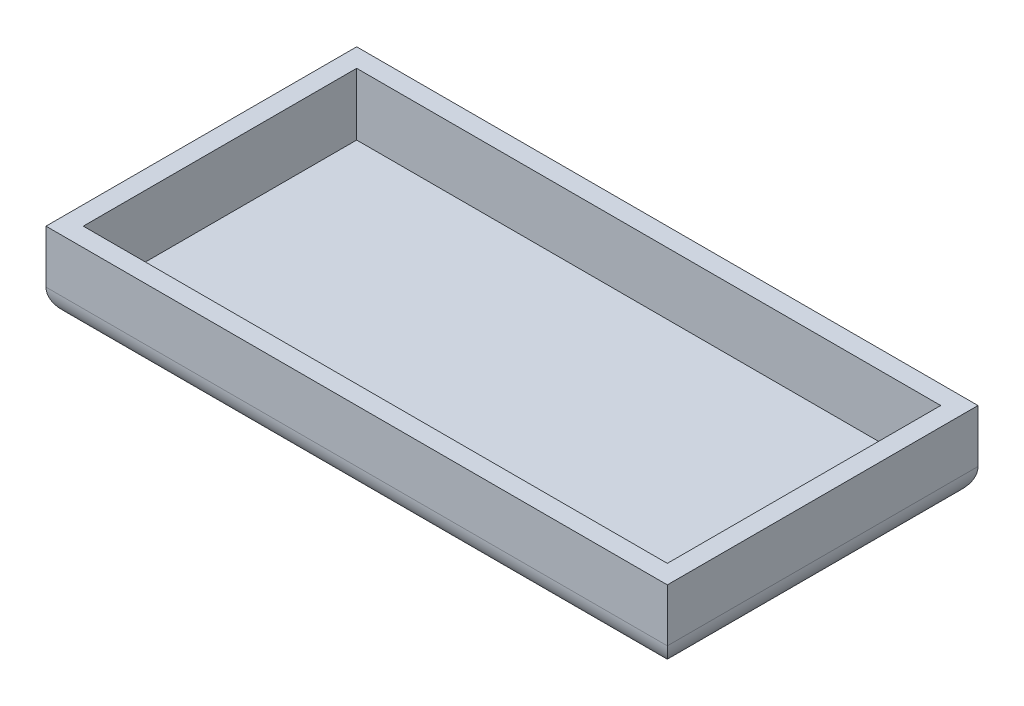
ISO-10303-21;
HEADER;
FILE_DESCRIPTION(('STEP AP214'),'2;1');
FILE_NAME('part.step','',(''),(''),'','','');
FILE_SCHEMA(('AUTOMOTIVE_DESIGN { 1 0 10303 214 1 1 1 1 }'));
ENDSEC;
DATA;
#1=APPLICATION_CONTEXT('core data for automotive mechanical design processes');
#2=APPLICATION_PROTOCOL_DEFINITION('international standard','automotive_design',2000,#1);
#3=PRODUCT_CONTEXT('',#1,'mechanical');
#4=PRODUCT('Part','Part','',(#3));
#5=PRODUCT_RELATED_PRODUCT_CATEGORY('part','',(#4));
#6=PRODUCT_DEFINITION_FORMATION('','',#4);
#7=PRODUCT_DEFINITION_CONTEXT('part definition',#1,'design');
#8=PRODUCT_DEFINITION('design','',#6,#7);
#9=PRODUCT_DEFINITION_SHAPE('','',#8);
#10=(LENGTH_UNIT() NAMED_UNIT(*) SI_UNIT(.MILLI.,.METRE.));
#11=(NAMED_UNIT(*) PLANE_ANGLE_UNIT() SI_UNIT($,.RADIAN.));
#12=(NAMED_UNIT(*) SI_UNIT($,.STERADIAN.) SOLID_ANGLE_UNIT());
#13=UNCERTAINTY_MEASURE_WITH_UNIT(LENGTH_MEASURE(1.E-05),#10,'distance_accuracy_value','');
#14=(GEOMETRIC_REPRESENTATION_CONTEXT(3) GLOBAL_UNCERTAINTY_ASSIGNED_CONTEXT((#13)) GLOBAL_UNIT_ASSIGNED_CONTEXT((#10,
#11,#12)) REPRESENTATION_CONTEXT('',''));
#15=CARTESIAN_POINT('',(0.,0.,0.));
#16=DIRECTION('',(0.,0.,1.));
#17=DIRECTION('',(1.,0.,0.));
#18=AXIS2_PLACEMENT_3D('',#15,#16,#17);
#19=CARTESIAN_POINT('',(2000.,120.,1000.));
#20=DIRECTION('',(-1.,0.,0.));
#21=DIRECTION('',(0.,0.,1.));
#22=AXIS2_PLACEMENT_3D('',#19,#20,#21);
#23=PLANE('',#22);
#24=DIRECTION('',(0.,-1.,0.));
#25=VECTOR('',#24,1.);
#26=CARTESIAN_POINT('',(2000.,120.,1000.));
#27=LINE('',#26,#25);
#28=CARTESIAN_POINT('',(2000.,520.,1000.));
#29=VERTEX_POINT('',#28);
#30=CARTESIAN_POINT('',(2000.,180.,1000.));
#31=VERTEX_POINT('',#30);
#32=EDGE_CURVE('E168',#29,#31,#27,.T.);
#33=ORIENTED_EDGE('',*,*,#32,.T.);
#34=DIRECTION('',(0.,0.,-1.));
#35=VECTOR('',#34,1.);
#36=CARTESIAN_POINT('',(2000.,180.,-1000.));
#37=LINE('',#36,#35);
#38=CARTESIAN_POINT('',(2000.,180.,-1000.));
#39=VERTEX_POINT('',#38);
#40=EDGE_CURVE('E45',#31,#39,#37,.T.);
#41=ORIENTED_EDGE('',*,*,#40,.T.);
#42=DIRECTION('',(0.,-1.,0.));
#43=VECTOR('',#42,1.);
#44=CARTESIAN_POINT('',(2000.,120.,-1000.));
#45=LINE('',#44,#43);
#46=CARTESIAN_POINT('',(2000.,520.,-1000.));
#47=VERTEX_POINT('',#46);
#48=EDGE_CURVE('E175',#47,#39,#45,.T.);
#49=ORIENTED_EDGE('',*,*,#48,.F.);
#50=DIRECTION('',(0.,0.,-1.));
#51=VECTOR('',#50,1.);
#52=CARTESIAN_POINT('',(2000.,520.,1000.));
#53=LINE('',#52,#51);
#54=EDGE_CURVE('E133',#29,#47,#53,.T.);
#55=ORIENTED_EDGE('',*,*,#54,.F.);
#56=EDGE_LOOP('',(#33,#41,#49,#55));
#57=FACE_BOUND('',#56,.T.);
#58=ADVANCED_FACE('F36',(#57),#23,.F.);
#59=CARTESIAN_POINT('',(-2000.,120.,-1000.));
#60=DIRECTION('',(0.,0.,1.));
#61=DIRECTION('',(1.,0.,0.));
#62=AXIS2_PLACEMENT_3D('',#59,#60,#61);
#63=PLANE('',#62);
#64=ORIENTED_EDGE('',*,*,#48,.T.);
#65=DIRECTION('',(-1.,0.,0.));
#66=VECTOR('',#65,1.);
#67=CARTESIAN_POINT('',(-2000.,180.,-1000.));
#68=LINE('',#67,#66);
#69=CARTESIAN_POINT('',(-2000.,180.,-1000.));
#70=VERTEX_POINT('',#69);
#71=EDGE_CURVE('E11',#39,#70,#68,.T.);
#72=ORIENTED_EDGE('',*,*,#71,.T.);
#73=DIRECTION('',(0.,-1.,0.));
#74=VECTOR('',#73,1.);
#75=CARTESIAN_POINT('',(-2000.,120.,-1000.));
#76=LINE('',#75,#74);
#77=CARTESIAN_POINT('',(-2000.,520.,-1000.));
#78=VERTEX_POINT('',#77);
#79=EDGE_CURVE('E172',#78,#70,#76,.T.);
#80=ORIENTED_EDGE('',*,*,#79,.F.);
#81=DIRECTION('',(-1.,0.,0.));
#82=VECTOR('',#81,1.);
#83=CARTESIAN_POINT('',(2000.,520.,-1000.));
#84=LINE('',#83,#82);
#85=EDGE_CURVE('E159',#47,#78,#84,.T.);
#86=ORIENTED_EDGE('',*,*,#85,.F.);
#87=EDGE_LOOP('',(#64,#72,#80,#86));
#88=FACE_BOUND('',#87,.T.);
#89=ADVANCED_FACE('F225',(#88),#63,.F.);
#90=CARTESIAN_POINT('',(-2000.,120.,1000.));
#91=DIRECTION('',(1.,0.,0.));
#92=DIRECTION('',(0.,0.,-1.));
#93=AXIS2_PLACEMENT_3D('',#90,#91,#92);
#94=PLANE('',#93);
#95=ORIENTED_EDGE('',*,*,#79,.T.);
#96=DIRECTION('',(0.,0.,1.));
#97=VECTOR('',#96,1.);
#98=CARTESIAN_POINT('',(-2000.,180.,1000.));
#99=LINE('',#98,#97);
#100=CARTESIAN_POINT('',(-2000.,180.,1000.));
#101=VERTEX_POINT('',#100);
#102=EDGE_CURVE('E177',#70,#101,#99,.T.);
#103=ORIENTED_EDGE('',*,*,#102,.T.);
#104=DIRECTION('',(0.,-1.,0.));
#105=VECTOR('',#104,1.);
#106=CARTESIAN_POINT('',(-2000.,120.,1000.));
#107=LINE('',#106,#105);
#108=CARTESIAN_POINT('',(-2000.,520.,1000.));
#109=VERTEX_POINT('',#108);
#110=EDGE_CURVE('E170',#109,#101,#107,.T.);
#111=ORIENTED_EDGE('',*,*,#110,.F.);
#112=DIRECTION('',(0.,0.,1.));
#113=VECTOR('',#112,1.);
#114=CARTESIAN_POINT('',(-2000.,520.,-1000.));
#115=LINE('',#114,#113);
#116=EDGE_CURVE('E162',#78,#109,#115,.T.);
#117=ORIENTED_EDGE('',*,*,#116,.F.);
#118=EDGE_LOOP('',(#95,#103,#111,#117));
#119=FACE_BOUND('',#118,.T.);
#120=ADVANCED_FACE('F217',(#119),#94,.F.);
#121=CARTESIAN_POINT('',(-2000.,120.,1000.));
#122=DIRECTION('',(0.,0.,-1.));
#123=DIRECTION('',(-1.,0.,0.));
#124=AXIS2_PLACEMENT_3D('',#121,#122,#123);
#125=PLANE('',#124);
#126=ORIENTED_EDGE('',*,*,#110,.T.);
#127=DIRECTION('',(1.,0.,0.));
#128=VECTOR('',#127,1.);
#129=CARTESIAN_POINT('',(2000.,180.,1000.));
#130=LINE('',#129,#128);
#131=EDGE_CURVE('E60',#101,#31,#130,.T.);
#132=ORIENTED_EDGE('',*,*,#131,.T.);
#133=ORIENTED_EDGE('',*,*,#32,.F.);
#134=DIRECTION('',(1.,0.,0.));
#135=VECTOR('',#134,1.);
#136=CARTESIAN_POINT('',(-2000.,520.,1000.));
#137=LINE('',#136,#135);
#138=EDGE_CURVE('E165',#109,#29,#137,.T.);
#139=ORIENTED_EDGE('',*,*,#138,.F.);
#140=EDGE_LOOP('',(#126,#132,#133,#139));
#141=FACE_BOUND('',#140,.T.);
#142=ADVANCED_FACE('F220',(#141),#125,.F.);
#143=CARTESIAN_POINT('',(0.,0.,0.));
#144=DIRECTION('',(0.,-1.,0.));
#145=DIRECTION('',(0.,0.,-1.));
#146=AXIS2_PLACEMENT_3D('',#143,#144,#145);
#147=PLANE('',#146);
#148=DIRECTION('',(1.,0.,0.));
#149=VECTOR('',#148,1.);
#150=CARTESIAN_POINT('',(-2000.,0.,820.));
#151=LINE('',#150,#149);
#152=CARTESIAN_POINT('',(1820.,0.,820.));
#153=VERTEX_POINT('',#152);
#154=CARTESIAN_POINT('',(-1820.,0.,820.));
#155=VERTEX_POINT('',#154);
#156=EDGE_CURVE('E184',#153,#155,#151,.F.);
#157=ORIENTED_EDGE('',*,*,#156,.T.);
#158=DIRECTION('',(0.,0.,1.));
#159=VECTOR('',#158,1.);
#160=CARTESIAN_POINT('',(-1820.,0.,-1000.));
#161=LINE('',#160,#159);
#162=CARTESIAN_POINT('',(-1820.,0.,-820.));
#163=VERTEX_POINT('',#162);
#164=EDGE_CURVE('E186',#155,#163,#161,.F.);
#165=ORIENTED_EDGE('',*,*,#164,.T.);
#166=DIRECTION('',(-1.,0.,0.));
#167=VECTOR('',#166,1.);
#168=CARTESIAN_POINT('',(2000.,0.,-820.));
#169=LINE('',#168,#167);
#170=CARTESIAN_POINT('',(1820.,0.,-820.));
#171=VERTEX_POINT('',#170);
#172=EDGE_CURVE('E180',#163,#171,#169,.F.);
#173=ORIENTED_EDGE('',*,*,#172,.T.);
#174=DIRECTION('',(0.,0.,-1.));
#175=VECTOR('',#174,1.);
#176=CARTESIAN_POINT('',(1820.,0.,1000.));
#177=LINE('',#176,#175);
#178=EDGE_CURVE('E182',#171,#153,#177,.F.);
#179=ORIENTED_EDGE('',*,*,#178,.T.);
#180=EDGE_LOOP('',(#157,#165,#173,#179));
#181=FACE_BOUND('',#180,.T.);
#182=ADVANCED_FACE('F209',(#181),#147,.T.);
#183=CARTESIAN_POINT('',(0.,520.,0.));
#184=DIRECTION('',(0.,1.,0.));
#185=DIRECTION('',(0.,0.,1.));
#186=AXIS2_PLACEMENT_3D('',#183,#184,#185);
#187=PLANE('',#186);
#188=ORIENTED_EDGE('',*,*,#54,.T.);
#189=ORIENTED_EDGE('',*,*,#85,.T.);
#190=ORIENTED_EDGE('',*,*,#116,.T.);
#191=ORIENTED_EDGE('',*,*,#138,.T.);
#192=EDGE_LOOP('',(#188,#189,#190,#191));
#193=FACE_BOUND('',#192,.T.);
#194=DIRECTION('',(-1.,0.,0.));
#195=VECTOR('',#194,1.);
#196=CARTESIAN_POINT('',(-1880.,520.,-880.));
#197=LINE('',#196,#195);
#198=CARTESIAN_POINT('',(1880.,520.,-880.));
#199=VERTEX_POINT('',#198);
#200=CARTESIAN_POINT('',(-1880.,520.,-880.));
#201=VERTEX_POINT('',#200);
#202=EDGE_CURVE('E125',#199,#201,#197,.T.);
#203=ORIENTED_EDGE('',*,*,#202,.F.);
#204=DIRECTION('',(0.,0.,-1.));
#205=VECTOR('',#204,1.);
#206=CARTESIAN_POINT('',(1880.,520.,880.));
#207=LINE('',#206,#205);
#208=CARTESIAN_POINT('',(1880.,520.,880.));
#209=VERTEX_POINT('',#208);
#210=EDGE_CURVE('E115',#209,#199,#207,.T.);
#211=ORIENTED_EDGE('',*,*,#210,.F.);
#212=DIRECTION('',(1.,0.,0.));
#213=VECTOR('',#212,1.);
#214=CARTESIAN_POINT('',(-1880.,520.,880.000000000001));
#215=LINE('',#214,#213);
#216=CARTESIAN_POINT('',(-1880.,520.,880.000000000001));
#217=VERTEX_POINT('',#216);
#218=EDGE_CURVE('E141',#217,#209,#215,.T.);
#219=ORIENTED_EDGE('',*,*,#218,.F.);
#220=DIRECTION('',(0.,0.,1.));
#221=VECTOR('',#220,1.);
#222=CARTESIAN_POINT('',(-1880.,520.,880.000000000001));
#223=LINE('',#222,#221);
#224=EDGE_CURVE('E139',#201,#217,#223,.T.);
#225=ORIENTED_EDGE('',*,*,#224,.F.);
#226=EDGE_LOOP('',(#203,#211,#219,#225));
#227=FACE_BOUND('',#226,.T.);
#228=ADVANCED_FACE('F137',(#193,#227),#187,.T.);
#229=CARTESIAN_POINT('',(1880.,520.,880.));
#230=DIRECTION('',(-1.,0.,0.));
#231=DIRECTION('',(0.,0.,1.));
#232=AXIS2_PLACEMENT_3D('',#229,#230,#231);
#233=PLANE('',#232);
#234=DIRECTION('',(0.,0.,-1.));
#235=VECTOR('',#234,1.);
#236=CARTESIAN_POINT('',(1880.,120.,880.));
#237=LINE('',#236,#235);
#238=CARTESIAN_POINT('',(1880.,120.,880.));
#239=VERTEX_POINT('',#238);
#240=CARTESIAN_POINT('',(1880.,120.,-880.));
#241=VERTEX_POINT('',#240);
#242=EDGE_CURVE('E145',#239,#241,#237,.T.);
#243=ORIENTED_EDGE('',*,*,#242,.F.);
#244=DIRECTION('',(0.,-1.,0.));
#245=VECTOR('',#244,1.);
#246=CARTESIAN_POINT('',(1880.,520.,880.));
#247=LINE('',#246,#245);
#248=EDGE_CURVE('E121',#209,#239,#247,.T.);
#249=ORIENTED_EDGE('',*,*,#248,.F.);
#250=ORIENTED_EDGE('',*,*,#210,.T.);
#251=DIRECTION('',(0.,-1.,0.));
#252=VECTOR('',#251,1.);
#253=CARTESIAN_POINT('',(1880.,520.,-880.));
#254=LINE('',#253,#252);
#255=EDGE_CURVE('E119',#199,#241,#254,.T.);
#256=ORIENTED_EDGE('',*,*,#255,.T.);
#257=EDGE_LOOP('',(#243,#249,#250,#256));
#258=FACE_BOUND('',#257,.T.);
#259=ADVANCED_FACE('F118',(#258),#233,.T.);
#260=CARTESIAN_POINT('',(-1880.,520.,-880.));
#261=DIRECTION('',(0.,0.,1.));
#262=DIRECTION('',(1.,0.,0.));
#263=AXIS2_PLACEMENT_3D('',#260,#261,#262);
#264=PLANE('',#263);
#265=DIRECTION('',(-1.,0.,0.));
#266=VECTOR('',#265,1.);
#267=CARTESIAN_POINT('',(-1880.,120.,-880.));
#268=LINE('',#267,#266);
#269=CARTESIAN_POINT('',(-1880.,120.,-880.));
#270=VERTEX_POINT('',#269);
#271=EDGE_CURVE('E132',#241,#270,#268,.T.);
#272=ORIENTED_EDGE('',*,*,#271,.F.);
#273=ORIENTED_EDGE('',*,*,#255,.F.);
#274=ORIENTED_EDGE('',*,*,#202,.T.);
#275=DIRECTION('',(0.,-1.,0.));
#276=VECTOR('',#275,1.);
#277=CARTESIAN_POINT('',(-1880.,520.,-880.));
#278=LINE('',#277,#276);
#279=EDGE_CURVE('E134',#201,#270,#278,.T.);
#280=ORIENTED_EDGE('',*,*,#279,.T.);
#281=EDGE_LOOP('',(#272,#273,#274,#280));
#282=FACE_BOUND('',#281,.T.);
#283=ADVANCED_FACE('F129',(#282),#264,.T.);
#284=CARTESIAN_POINT('',(-1880.,520.,880.000000000001));
#285=DIRECTION('',(1.,0.,0.));
#286=DIRECTION('',(0.,0.,-1.));
#287=AXIS2_PLACEMENT_3D('',#284,#285,#286);
#288=PLANE('',#287);
#289=DIRECTION('',(0.,0.,1.));
#290=VECTOR('',#289,1.);
#291=CARTESIAN_POINT('',(-1880.,120.,880.000000000001));
#292=LINE('',#291,#290);
#293=CARTESIAN_POINT('',(-1880.,120.,880.000000000001));
#294=VERTEX_POINT('',#293);
#295=EDGE_CURVE('E148',#270,#294,#292,.T.);
#296=ORIENTED_EDGE('',*,*,#295,.F.);
#297=ORIENTED_EDGE('',*,*,#279,.F.);
#298=ORIENTED_EDGE('',*,*,#224,.T.);
#299=DIRECTION('',(0.,-1.,0.));
#300=VECTOR('',#299,1.);
#301=CARTESIAN_POINT('',(-1880.,520.,880.000000000001));
#302=LINE('',#301,#300);
#303=EDGE_CURVE('E154',#217,#294,#302,.T.);
#304=ORIENTED_EDGE('',*,*,#303,.T.);
#305=EDGE_LOOP('',(#296,#297,#298,#304));
#306=FACE_BOUND('',#305,.T.);
#307=ADVANCED_FACE('F253',(#306),#288,.T.);
#308=CARTESIAN_POINT('',(-1880.,520.,880.000000000001));
#309=DIRECTION('',(0.,0.,-1.));
#310=DIRECTION('',(-1.,0.,0.));
#311=AXIS2_PLACEMENT_3D('',#308,#309,#310);
#312=PLANE('',#311);
#313=DIRECTION('',(1.,0.,0.));
#314=VECTOR('',#313,1.);
#315=CARTESIAN_POINT('',(-1880.,120.,880.000000000001));
#316=LINE('',#315,#314);
#317=EDGE_CURVE('E126',#294,#239,#316,.T.);
#318=ORIENTED_EDGE('',*,*,#317,.F.);
#319=ORIENTED_EDGE('',*,*,#303,.F.);
#320=ORIENTED_EDGE('',*,*,#218,.T.);
#321=ORIENTED_EDGE('',*,*,#248,.T.);
#322=EDGE_LOOP('',(#318,#319,#320,#321));
#323=FACE_BOUND('',#322,.T.);
#324=ADVANCED_FACE('F247',(#323),#312,.T.);
#325=CARTESIAN_POINT('',(0.,120.,0.));
#326=DIRECTION('',(0.,-1.,0.));
#327=DIRECTION('',(0.,0.,-1.));
#328=AXIS2_PLACEMENT_3D('',#325,#326,#327);
#329=PLANE('',#328);
#330=ORIENTED_EDGE('',*,*,#317,.T.);
#331=ORIENTED_EDGE('',*,*,#242,.T.);
#332=ORIENTED_EDGE('',*,*,#271,.T.);
#333=ORIENTED_EDGE('',*,*,#295,.T.);
#334=EDGE_LOOP('',(#330,#331,#332,#333));
#335=FACE_BOUND('',#334,.T.);
#336=ADVANCED_FACE('F243',(#335),#329,.F.);
#337=CARTESIAN_POINT('',(1820.,180.,1000.));
#338=DIRECTION('',(0.,0.,1.));
#339=DIRECTION('',(1.,0.,0.));
#340=AXIS2_PLACEMENT_3D('',#337,#338,#339);
#341=CYLINDRICAL_SURFACE('',#340,180.);
#342=CARTESIAN_POINT('',(1820.,180.,820.));
#343=DIRECTION('',(-0.707106781186547,0.,0.707106781186547));
#344=DIRECTION('',(0.707106781186547,0.,0.707106781186547));
#345=AXIS2_PLACEMENT_3D('',#342,#343,#344);
#346=ELLIPSE('',#345,254.558441227157,180.);
#347=EDGE_CURVE('E194',#153,#31,#346,.T.);
#348=ORIENTED_EDGE('',*,*,#347,.F.);
#349=ORIENTED_EDGE('',*,*,#178,.F.);
#350=CARTESIAN_POINT('',(1820.,180.,-820.));
#351=DIRECTION('',(0.707106781186547,0.,0.707106781186547));
#352=DIRECTION('',(0.707106781186547,0.,-0.707106781186547));
#353=AXIS2_PLACEMENT_3D('',#350,#351,#352);
#354=ELLIPSE('',#353,254.558441227157,180.);
#355=EDGE_CURVE('E40',#39,#171,#354,.F.);
#356=ORIENTED_EDGE('',*,*,#355,.F.);
#357=ORIENTED_EDGE('',*,*,#40,.F.);
#358=EDGE_LOOP('',(#348,#349,#356,#357));
#359=FACE_BOUND('',#358,.T.);
#360=ADVANCED_FACE('F38',(#359),#341,.T.);
#361=CARTESIAN_POINT('',(-2000.,180.,-820.));
#362=DIRECTION('',(1.,0.,0.));
#363=DIRECTION('',(0.,0.,-1.));
#364=AXIS2_PLACEMENT_3D('',#361,#362,#363);
#365=CYLINDRICAL_SURFACE('',#364,180.);
#366=ORIENTED_EDGE('',*,*,#355,.T.);
#367=ORIENTED_EDGE('',*,*,#172,.F.);
#368=CARTESIAN_POINT('',(-1820.,180.,-820.));
#369=DIRECTION('',(0.707106781186547,0.,-0.707106781186547));
#370=DIRECTION('',(0.707106781186547,0.,0.707106781186547));
#371=AXIS2_PLACEMENT_3D('',#368,#369,#370);
#372=ELLIPSE('',#371,254.558441227157,180.);
#373=EDGE_CURVE('E193',#70,#163,#372,.F.);
#374=ORIENTED_EDGE('',*,*,#373,.F.);
#375=ORIENTED_EDGE('',*,*,#71,.F.);
#376=EDGE_LOOP('',(#366,#367,#374,#375));
#377=FACE_BOUND('',#376,.T.);
#378=ADVANCED_FACE('F204',(#377),#365,.T.);
#379=CARTESIAN_POINT('',(-2000.,180.,820.));
#380=DIRECTION('',(-1.,0.,0.));
#381=DIRECTION('',(0.,0.,1.));
#382=AXIS2_PLACEMENT_3D('',#379,#380,#381);
#383=CYLINDRICAL_SURFACE('',#382,180.);
#384=ORIENTED_EDGE('',*,*,#347,.T.);
#385=ORIENTED_EDGE('',*,*,#131,.F.);
#386=CARTESIAN_POINT('',(-1820.,180.,820.));
#387=DIRECTION('',(-0.707106781186547,0.,-0.707106781186547));
#388=DIRECTION('',(-0.707106781186547,0.,0.707106781186547));
#389=AXIS2_PLACEMENT_3D('',#386,#387,#388);
#390=ELLIPSE('',#389,254.558441227157,180.);
#391=EDGE_CURVE('E191',#155,#101,#390,.T.);
#392=ORIENTED_EDGE('',*,*,#391,.F.);
#393=ORIENTED_EDGE('',*,*,#156,.F.);
#394=EDGE_LOOP('',(#384,#385,#392,#393));
#395=FACE_BOUND('',#394,.T.);
#396=ADVANCED_FACE('F215',(#395),#383,.T.);
#397=CARTESIAN_POINT('',(-1820.,180.,1000.));
#398=DIRECTION('',(0.,0.,-1.));
#399=DIRECTION('',(-1.,0.,0.));
#400=AXIS2_PLACEMENT_3D('',#397,#398,#399);
#401=CYLINDRICAL_SURFACE('',#400,180.);
#402=ORIENTED_EDGE('',*,*,#373,.T.);
#403=ORIENTED_EDGE('',*,*,#164,.F.);
#404=ORIENTED_EDGE('',*,*,#391,.T.);
#405=ORIENTED_EDGE('',*,*,#102,.F.);
#406=EDGE_LOOP('',(#402,#403,#404,#405));
#407=FACE_BOUND('',#406,.T.);
#408=ADVANCED_FACE('F213',(#407),#401,.T.);
#409=CLOSED_SHELL('',(#58,#89,#120,#142,#182,#228,#259,#283,#307,#324,#336,#360,#378,#396,#408));
#410=MANIFOLD_SOLID_BREP('B2',#409);
#411=ADVANCED_BREP_SHAPE_REPRESENTATION('',(#18,#410),#14);
#412=SHAPE_DEFINITION_REPRESENTATION(#9,#411);
ENDSEC;
END-ISO-10303-21;
